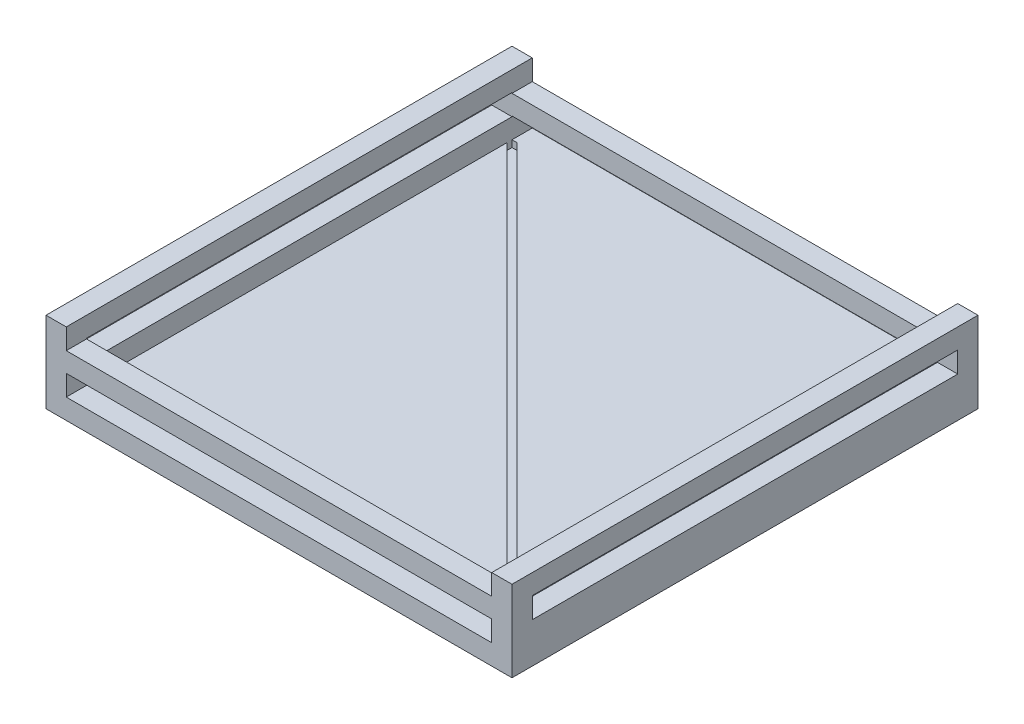
ISO-10303-21;
HEADER;
FILE_DESCRIPTION(('STEP AP214'),'2;1');
FILE_NAME('part.step','',(''),(''),'','','');
FILE_SCHEMA(('AUTOMOTIVE_DESIGN { 1 0 10303 214 1 1 1 1 }'));
ENDSEC;
DATA;
#1=APPLICATION_CONTEXT('core data for automotive mechanical design processes');
#2=APPLICATION_PROTOCOL_DEFINITION('international standard','automotive_design',2000,#1);
#3=PRODUCT_CONTEXT('',#1,'mechanical');
#4=PRODUCT('Part','Part','',(#3));
#5=PRODUCT_RELATED_PRODUCT_CATEGORY('part','',(#4));
#6=PRODUCT_DEFINITION_FORMATION('','',#4);
#7=PRODUCT_DEFINITION_CONTEXT('part definition',#1,'design');
#8=PRODUCT_DEFINITION('design','',#6,#7);
#9=PRODUCT_DEFINITION_SHAPE('','',#8);
#10=(LENGTH_UNIT() NAMED_UNIT(*) SI_UNIT(.MILLI.,.METRE.));
#11=(NAMED_UNIT(*) PLANE_ANGLE_UNIT() SI_UNIT($,.RADIAN.));
#12=(NAMED_UNIT(*) SI_UNIT($,.STERADIAN.) SOLID_ANGLE_UNIT());
#13=UNCERTAINTY_MEASURE_WITH_UNIT(LENGTH_MEASURE(1.E-05),#10,'distance_accuracy_value','');
#14=(GEOMETRIC_REPRESENTATION_CONTEXT(3) GLOBAL_UNCERTAINTY_ASSIGNED_CONTEXT((#13)) GLOBAL_UNIT_ASSIGNED_CONTEXT((#10,
#11,#12)) REPRESENTATION_CONTEXT('',''));
#15=CARTESIAN_POINT('',(0.,0.,0.));
#16=DIRECTION('',(0.,0.,1.));
#17=DIRECTION('',(1.,0.,0.));
#18=AXIS2_PLACEMENT_3D('',#15,#16,#17);
#19=CARTESIAN_POINT('',(0.,5.,0.));
#20=DIRECTION('',(0.,1.,0.));
#21=DIRECTION('',(0.,0.,1.));
#22=AXIS2_PLACEMENT_3D('',#19,#20,#21);
#23=PLANE('',#22);
#24=DIRECTION('',(1.,0.,0.));
#25=VECTOR('',#24,1.);
#26=CARTESIAN_POINT('',(52.5,5.,52.5));
#27=LINE('',#26,#25);
#28=CARTESIAN_POINT('',(51.2649201555275,5.,52.5));
#29=VERTEX_POINT('',#28);
#30=CARTESIAN_POINT('',(52.5,5.,52.5));
#31=VERTEX_POINT('',#30);
#32=EDGE_CURVE('E268',#29,#31,#27,.T.);
#33=ORIENTED_EDGE('',*,*,#32,.F.);
#34=DIRECTION('',(0.707106781186547,0.,0.707106781186547));
#35=VECTOR('',#34,1.);
#36=CARTESIAN_POINT('',(-52.5,5.,-51.2649201555275));
#37=LINE('',#36,#35);
#38=CARTESIAN_POINT('',(-52.5,5.,-51.2649201555275));
#39=VERTEX_POINT('',#38);
#40=EDGE_CURVE('E272',#39,#29,#37,.T.);
#41=ORIENTED_EDGE('',*,*,#40,.F.);
#42=DIRECTION('',(0.,0.,-1.));
#43=VECTOR('',#42,1.);
#44=CARTESIAN_POINT('',(-52.5,5.,0.));
#45=LINE('',#44,#43);
#46=CARTESIAN_POINT('',(-52.5,5.,57.5));
#47=VERTEX_POINT('',#46);
#48=EDGE_CURVE('E462',#47,#39,#45,.T.);
#49=ORIENTED_EDGE('',*,*,#48,.F.);
#50=DIRECTION('',(1.,0.,0.));
#51=VECTOR('',#50,1.);
#52=CARTESIAN_POINT('',(-57.5,5.,57.5));
#53=LINE('',#52,#51);
#54=CARTESIAN_POINT('',(52.5,5.,57.5));
#55=VERTEX_POINT('',#54);
#56=EDGE_CURVE('E517',#47,#55,#53,.T.);
#57=ORIENTED_EDGE('',*,*,#56,.T.);
#58=DIRECTION('',(0.,0.,-1.));
#59=VECTOR('',#58,1.);
#60=CARTESIAN_POINT('',(52.5,5.,-52.5));
#61=LINE('',#60,#59);
#62=EDGE_CURVE('E440',#55,#31,#61,.T.);
#63=ORIENTED_EDGE('',*,*,#62,.T.);
#64=EDGE_LOOP('',(#33,#41,#49,#57,#63));
#65=FACE_BOUND('',#64,.T.);
#66=ADVANCED_FACE('F46',(#65),#23,.T.);
#67=CARTESIAN_POINT('',(-52.5,0.,0.));
#68=DIRECTION('',(-1.,0.,0.));
#69=DIRECTION('',(0.,0.,1.));
#70=AXIS2_PLACEMENT_3D('',#67,#68,#69);
#71=PLANE('',#70);
#72=DIRECTION('',(0.,0.,1.));
#73=VECTOR('',#72,1.);
#74=CARTESIAN_POINT('',(-52.5,9.92,0.));
#75=LINE('',#74,#73);
#76=CARTESIAN_POINT('',(-52.5,9.92,-52.5));
#77=VERTEX_POINT('',#76);
#78=CARTESIAN_POINT('',(-52.5,9.92,52.5));
#79=VERTEX_POINT('',#78);
#80=EDGE_CURVE('E448',#77,#79,#75,.T.);
#81=ORIENTED_EDGE('',*,*,#80,.T.);
#82=DIRECTION('',(0.,1.,0.));
#83=VECTOR('',#82,1.);
#84=CARTESIAN_POINT('',(-52.5,0.,52.5));
#85=LINE('',#84,#83);
#86=CARTESIAN_POINT('',(-52.5,10.08,52.5));
#87=VERTEX_POINT('',#86);
#88=EDGE_CURVE('E444',#79,#87,#85,.T.);
#89=ORIENTED_EDGE('',*,*,#88,.T.);
#90=DIRECTION('',(0.,0.,-1.));
#91=VECTOR('',#90,1.);
#92=CARTESIAN_POINT('',(-52.5,10.08,173.474135047432));
#93=LINE('',#92,#91);
#94=CARTESIAN_POINT('',(-52.5,10.08,57.5));
#95=VERTEX_POINT('',#94);
#96=EDGE_CURVE('E328',#95,#87,#93,.T.);
#97=ORIENTED_EDGE('',*,*,#96,.F.);
#98=DIRECTION('',(0.,1.,0.));
#99=VECTOR('',#98,1.);
#100=CARTESIAN_POINT('',(-52.5,0.,57.5));
#101=LINE('',#100,#99);
#102=EDGE_CURVE('E467',#47,#95,#101,.T.);
#103=ORIENTED_EDGE('',*,*,#102,.F.);
#104=ORIENTED_EDGE('',*,*,#48,.T.);
#105=DIRECTION('',(0.,1.,0.));
#106=VECTOR('',#105,1.);
#107=CARTESIAN_POINT('',(-52.5,3.33,-51.2649201555275));
#108=LINE('',#107,#106);
#109=CARTESIAN_POINT('',(-52.5,3.33,-51.2649201555275));
#110=VERTEX_POINT('',#109);
#111=EDGE_CURVE('E303',#110,#39,#108,.T.);
#112=ORIENTED_EDGE('',*,*,#111,.F.);
#113=DIRECTION('',(0.,0.,1.));
#114=VECTOR('',#113,1.);
#115=CARTESIAN_POINT('',(-52.5,3.33,-51.2649201555275));
#116=LINE('',#115,#114);
#117=CARTESIAN_POINT('',(-52.5,3.33,-52.5));
#118=VERTEX_POINT('',#117);
#119=EDGE_CURVE('E277',#118,#110,#116,.T.);
#120=ORIENTED_EDGE('',*,*,#119,.F.);
#121=DIRECTION('',(0.,1.,0.));
#122=VECTOR('',#121,1.);
#123=CARTESIAN_POINT('',(-52.5,3.33,-52.5));
#124=LINE('',#123,#122);
#125=CARTESIAN_POINT('',(-52.5,5.,-52.5));
#126=VERTEX_POINT('',#125);
#127=EDGE_CURVE('E306',#118,#126,#124,.T.);
#128=ORIENTED_EDGE('',*,*,#127,.T.);
#129=CARTESIAN_POINT('',(-52.5,5.,-57.5));
#130=VERTEX_POINT('',#129);
#131=EDGE_CURVE('E461',#126,#130,#45,.T.);
#132=ORIENTED_EDGE('',*,*,#131,.T.);
#133=DIRECTION('',(0.,1.,0.));
#134=VECTOR('',#133,1.);
#135=CARTESIAN_POINT('',(-52.5,0.,-57.5));
#136=LINE('',#135,#134);
#137=CARTESIAN_POINT('',(-52.5,10.08,-57.5));
#138=VERTEX_POINT('',#137);
#139=EDGE_CURVE('E475',#130,#138,#136,.T.);
#140=ORIENTED_EDGE('',*,*,#139,.T.);
#141=DIRECTION('',(0.,0.,-1.));
#142=VECTOR('',#141,1.);
#143=CARTESIAN_POINT('',(-52.5,10.08,-52.5));
#144=LINE('',#143,#142);
#145=CARTESIAN_POINT('',(-52.5,10.08,-52.5));
#146=VERTEX_POINT('',#145);
#147=EDGE_CURVE('E433',#146,#138,#144,.T.);
#148=ORIENTED_EDGE('',*,*,#147,.F.);
#149=DIRECTION('',(0.,1.,0.));
#150=VECTOR('',#149,1.);
#151=CARTESIAN_POINT('',(-52.5,0.,-52.5));
#152=LINE('',#151,#150);
#153=EDGE_CURVE('E453',#77,#146,#152,.T.);
#154=ORIENTED_EDGE('',*,*,#153,.F.);
#155=EDGE_LOOP('',(#81,#89,#97,#103,#104,#112,#120,#128,#132,#140,#148,#154));
#156=FACE_BOUND('',#155,.T.);
#157=ADVANCED_FACE('F596',(#156),#71,.F.);
#158=DIRECTION('',(0.,0.,1.));
#159=VECTOR('',#158,1.);
#160=CARTESIAN_POINT('',(-52.5,20.,0.));
#161=LINE('',#160,#159);
#162=CARTESIAN_POINT('',(-52.5,20.,-57.5));
#163=VERTEX_POINT('',#162);
#164=CARTESIAN_POINT('',(-52.5,20.,57.5));
#165=VERTEX_POINT('',#164);
#166=EDGE_CURVE('E471',#163,#165,#161,.T.);
#167=ORIENTED_EDGE('',*,*,#166,.T.);
#168=CARTESIAN_POINT('',(-52.5,14.92,57.5));
#169=VERTEX_POINT('',#168);
#170=EDGE_CURVE('E466',#169,#165,#101,.T.);
#171=ORIENTED_EDGE('',*,*,#170,.F.);
#172=DIRECTION('',(0.,0.,-1.));
#173=VECTOR('',#172,1.);
#174=CARTESIAN_POINT('',(-52.5,14.92,173.474135047432));
#175=LINE('',#174,#173);
#176=CARTESIAN_POINT('',(-52.5,14.92,52.5));
#177=VERTEX_POINT('',#176);
#178=EDGE_CURVE('E70',#169,#177,#175,.T.);
#179=ORIENTED_EDGE('',*,*,#178,.T.);
#180=CARTESIAN_POINT('',(-52.5,15.08,52.5));
#181=VERTEX_POINT('',#180);
#182=EDGE_CURVE('E449',#177,#181,#85,.T.);
#183=ORIENTED_EDGE('',*,*,#182,.T.);
#184=DIRECTION('',(0.,0.,1.));
#185=VECTOR('',#184,1.);
#186=CARTESIAN_POINT('',(-52.5,15.08,0.));
#187=LINE('',#186,#185);
#188=CARTESIAN_POINT('',(-52.5,15.08,-52.5));
#189=VERTEX_POINT('',#188);
#190=EDGE_CURVE('E457',#189,#181,#187,.T.);
#191=ORIENTED_EDGE('',*,*,#190,.F.);
#192=CARTESIAN_POINT('',(-52.5,14.92,-52.5));
#193=VERTEX_POINT('',#192);
#194=EDGE_CURVE('E452',#193,#189,#152,.T.);
#195=ORIENTED_EDGE('',*,*,#194,.F.);
#196=DIRECTION('',(0.,0.,-1.));
#197=VECTOR('',#196,1.);
#198=CARTESIAN_POINT('',(-52.5,14.92,-52.5));
#199=LINE('',#198,#197);
#200=CARTESIAN_POINT('',(-52.5,14.92,-57.5));
#201=VERTEX_POINT('',#200);
#202=EDGE_CURVE('E429',#193,#201,#199,.T.);
#203=ORIENTED_EDGE('',*,*,#202,.T.);
#204=EDGE_CURVE('E474',#201,#163,#136,.T.);
#205=ORIENTED_EDGE('',*,*,#204,.T.);
#206=EDGE_LOOP('',(#167,#171,#179,#183,#191,#195,#203,#205));
#207=FACE_BOUND('',#206,.T.);
#208=ADVANCED_FACE('F603',(#207),#71,.F.);
#209=CARTESIAN_POINT('',(52.5,14.92,-52.5));
#210=DIRECTION('',(-1.,0.,0.));
#211=DIRECTION('',(0.,0.,1.));
#212=AXIS2_PLACEMENT_3D('',#209,#210,#211);
#213=PLANE('',#212);
#214=DIRECTION('',(0.,-1.,0.));
#215=VECTOR('',#214,1.);
#216=CARTESIAN_POINT('',(52.5,10.08,-57.5));
#217=LINE('',#216,#215);
#218=CARTESIAN_POINT('',(52.5,10.08,-57.5));
#219=VERTEX_POINT('',#218);
#220=CARTESIAN_POINT('',(52.5,5.,-57.5));
#221=VERTEX_POINT('',#220);
#222=EDGE_CURVE('E340',#219,#221,#217,.T.);
#223=ORIENTED_EDGE('',*,*,#222,.T.);
#224=CARTESIAN_POINT('',(52.5,5.,51.2649201555275));
#225=VERTEX_POINT('',#224);
#226=EDGE_CURVE('E250',#225,#221,#61,.T.);
#227=ORIENTED_EDGE('',*,*,#226,.F.);
#228=DIRECTION('',(0.,1.,0.));
#229=VECTOR('',#228,1.);
#230=CARTESIAN_POINT('',(52.5,3.33,51.2649201555275));
#231=LINE('',#230,#229);
#232=CARTESIAN_POINT('',(52.5,3.33,51.2649201555275));
#233=VERTEX_POINT('',#232);
#234=EDGE_CURVE('E62',#233,#225,#231,.T.);
#235=ORIENTED_EDGE('',*,*,#234,.F.);
#236=DIRECTION('',(0.,0.,-1.));
#237=VECTOR('',#236,1.);
#238=CARTESIAN_POINT('',(52.5,3.33,51.2649201555275));
#239=LINE('',#238,#237);
#240=CARTESIAN_POINT('',(52.5,3.33,52.5));
#241=VERTEX_POINT('',#240);
#242=EDGE_CURVE('E248',#241,#233,#239,.T.);
#243=ORIENTED_EDGE('',*,*,#242,.F.);
#244=DIRECTION('',(0.,1.,0.));
#245=VECTOR('',#244,1.);
#246=CARTESIAN_POINT('',(52.5,3.33,52.5));
#247=LINE('',#246,#245);
#248=EDGE_CURVE('E296',#241,#31,#247,.T.);
#249=ORIENTED_EDGE('',*,*,#248,.T.);
#250=ORIENTED_EDGE('',*,*,#62,.F.);
#251=DIRECTION('',(0.,1.,0.));
#252=VECTOR('',#251,1.);
#253=CARTESIAN_POINT('',(52.5,14.92,57.5));
#254=LINE('',#253,#252);
#255=CARTESIAN_POINT('',(52.5,10.08,57.5));
#256=VERTEX_POINT('',#255);
#257=EDGE_CURVE('E377',#55,#256,#254,.T.);
#258=ORIENTED_EDGE('',*,*,#257,.T.);
#259=DIRECTION('',(0.,0.,-1.));
#260=VECTOR('',#259,1.);
#261=CARTESIAN_POINT('',(52.5,10.08,173.474135047432));
#262=LINE('',#261,#260);
#263=CARTESIAN_POINT('',(52.5,10.08,52.5));
#264=VERTEX_POINT('',#263);
#265=EDGE_CURVE('E325',#256,#264,#262,.T.);
#266=ORIENTED_EDGE('',*,*,#265,.T.);
#267=DIRECTION('',(0.,1.,0.));
#268=VECTOR('',#267,1.);
#269=CARTESIAN_POINT('',(52.5,14.92,52.5));
#270=LINE('',#269,#268);
#271=CARTESIAN_POINT('',(52.5,9.92,52.5));
#272=VERTEX_POINT('',#271);
#273=EDGE_CURVE('E358',#272,#264,#270,.T.);
#274=ORIENTED_EDGE('',*,*,#273,.F.);
#275=DIRECTION('',(0.,0.,1.));
#276=VECTOR('',#275,1.);
#277=CARTESIAN_POINT('',(52.5,9.92,-52.5));
#278=LINE('',#277,#276);
#279=CARTESIAN_POINT('',(52.5,9.92,-52.5));
#280=VERTEX_POINT('',#279);
#281=EDGE_CURVE('E353',#280,#272,#278,.T.);
#282=ORIENTED_EDGE('',*,*,#281,.F.);
#283=DIRECTION('',(0.,-1.,0.));
#284=VECTOR('',#283,1.);
#285=CARTESIAN_POINT('',(52.5,10.08,-52.5));
#286=LINE('',#285,#284);
#287=CARTESIAN_POINT('',(52.5,10.08,-52.5));
#288=VERTEX_POINT('',#287);
#289=EDGE_CURVE('E383',#288,#280,#286,.T.);
#290=ORIENTED_EDGE('',*,*,#289,.F.);
#291=DIRECTION('',(0.,0.,-1.));
#292=VECTOR('',#291,1.);
#293=CARTESIAN_POINT('',(52.5,10.08,-52.5));
#294=LINE('',#293,#292);
#295=EDGE_CURVE('E437',#288,#219,#294,.T.);
#296=ORIENTED_EDGE('',*,*,#295,.T.);
#297=EDGE_LOOP('',(#223,#227,#235,#243,#249,#250,#258,#266,#274,#282,#290,#296));
#298=FACE_BOUND('',#297,.T.);
#299=ADVANCED_FACE('F246',(#298),#213,.T.);
#300=DIRECTION('',(0.,0.,-1.));
#301=VECTOR('',#300,1.);
#302=CARTESIAN_POINT('',(52.5,15.08,-52.5));
#303=LINE('',#302,#301);
#304=CARTESIAN_POINT('',(52.5,15.08,52.5));
#305=VERTEX_POINT('',#304);
#306=CARTESIAN_POINT('',(52.5,15.08,-52.5));
#307=VERTEX_POINT('',#306);
#308=EDGE_CURVE('E318',#305,#307,#303,.T.);
#309=ORIENTED_EDGE('',*,*,#308,.F.);
#310=CARTESIAN_POINT('',(52.5,14.92,52.5));
#311=VERTEX_POINT('',#310);
#312=EDGE_CURVE('E357',#311,#305,#270,.T.);
#313=ORIENTED_EDGE('',*,*,#312,.F.);
#314=DIRECTION('',(0.,0.,-1.));
#315=VECTOR('',#314,1.);
#316=CARTESIAN_POINT('',(52.5,14.92,173.474135047432));
#317=LINE('',#316,#315);
#318=CARTESIAN_POINT('',(52.5,14.92,57.5));
#319=VERTEX_POINT('',#318);
#320=EDGE_CURVE('E315',#319,#311,#317,.T.);
#321=ORIENTED_EDGE('',*,*,#320,.F.);
#322=CARTESIAN_POINT('',(52.5,20.,57.5));
#323=VERTEX_POINT('',#322);
#324=EDGE_CURVE('E367',#319,#323,#254,.T.);
#325=ORIENTED_EDGE('',*,*,#324,.T.);
#326=DIRECTION('',(0.,0.,-1.));
#327=VECTOR('',#326,1.);
#328=CARTESIAN_POINT('',(52.5,20.,-52.5));
#329=LINE('',#328,#327);
#330=CARTESIAN_POINT('',(52.5,20.,-57.5));
#331=VERTEX_POINT('',#330);
#332=EDGE_CURVE('E423',#323,#331,#329,.T.);
#333=ORIENTED_EDGE('',*,*,#332,.T.);
#334=DIRECTION('',(0.,1.,0.));
#335=VECTOR('',#334,1.);
#336=CARTESIAN_POINT('',(52.5,14.92,-57.5));
#337=LINE('',#336,#335);
#338=CARTESIAN_POINT('',(52.5,14.92,-57.5));
#339=VERTEX_POINT('',#338);
#340=EDGE_CURVE('E412',#339,#331,#337,.T.);
#341=ORIENTED_EDGE('',*,*,#340,.F.);
#342=DIRECTION('',(0.,0.,-1.));
#343=VECTOR('',#342,1.);
#344=CARTESIAN_POINT('',(52.5,14.92,-52.5));
#345=LINE('',#344,#343);
#346=CARTESIAN_POINT('',(52.5,14.92,-52.5));
#347=VERTEX_POINT('',#346);
#348=EDGE_CURVE('E426',#347,#339,#345,.T.);
#349=ORIENTED_EDGE('',*,*,#348,.F.);
#350=DIRECTION('',(0.,1.,0.));
#351=VECTOR('',#350,1.);
#352=CARTESIAN_POINT('',(52.5,14.92,-52.5));
#353=LINE('',#352,#351);
#354=EDGE_CURVE('E395',#347,#307,#353,.T.);
#355=ORIENTED_EDGE('',*,*,#354,.T.);
#356=EDGE_LOOP('',(#309,#313,#321,#325,#333,#341,#349,#355));
#357=FACE_BOUND('',#356,.T.);
#358=ADVANCED_FACE('F577',(#357),#213,.T.);
#359=CARTESIAN_POINT('',(-52.5,0.,-52.5));
#360=DIRECTION('',(0.,0.,1.));
#361=DIRECTION('',(1.,0.,0.));
#362=AXIS2_PLACEMENT_3D('',#359,#360,#361);
#363=PLANE('',#362);
#364=DIRECTION('',(-1.,0.,0.));
#365=VECTOR('',#364,1.);
#366=CARTESIAN_POINT('',(52.5,10.08,-52.5));
#367=LINE('',#366,#365);
#368=EDGE_CURVE('E386',#288,#146,#367,.T.);
#369=ORIENTED_EDGE('',*,*,#368,.F.);
#370=ORIENTED_EDGE('',*,*,#289,.T.);
#371=DIRECTION('',(-1.,0.,0.));
#372=VECTOR('',#371,1.);
#373=CARTESIAN_POINT('',(173.474135047432,9.92,-52.5));
#374=LINE('',#373,#372);
#375=CARTESIAN_POINT('',(57.5,9.92,-52.5));
#376=VERTEX_POINT('',#375);
#377=EDGE_CURVE('E371',#376,#280,#374,.T.);
#378=ORIENTED_EDGE('',*,*,#377,.F.);
#379=DIRECTION('',(0.,1.,0.));
#380=VECTOR('',#379,1.);
#381=CARTESIAN_POINT('',(57.5,5.,-52.5));
#382=LINE('',#381,#380);
#383=CARTESIAN_POINT('',(57.5,15.08,-52.5));
#384=VERTEX_POINT('',#383);
#385=EDGE_CURVE('E399',#376,#384,#382,.T.);
#386=ORIENTED_EDGE('',*,*,#385,.T.);
#387=DIRECTION('',(-1.,0.,0.));
#388=VECTOR('',#387,1.);
#389=CARTESIAN_POINT('',(173.474135047432,15.08,-52.5));
#390=LINE('',#389,#388);
#391=EDGE_CURVE('E362',#384,#307,#390,.T.);
#392=ORIENTED_EDGE('',*,*,#391,.T.);
#393=ORIENTED_EDGE('',*,*,#354,.F.);
#394=DIRECTION('',(-1.,0.,0.));
#395=VECTOR('',#394,1.);
#396=CARTESIAN_POINT('',(52.5,14.92,-52.5));
#397=LINE('',#396,#395);
#398=EDGE_CURVE('E391',#347,#193,#397,.T.);
#399=ORIENTED_EDGE('',*,*,#398,.T.);
#400=ORIENTED_EDGE('',*,*,#194,.T.);
#401=DIRECTION('',(-1.,0.,0.));
#402=VECTOR('',#401,1.);
#403=CARTESIAN_POINT('',(-52.5,15.08,-52.5));
#404=LINE('',#403,#402);
#405=CARTESIAN_POINT('',(-57.5,15.08,-52.5));
#406=VERTEX_POINT('',#405);
#407=EDGE_CURVE('E508',#189,#406,#404,.T.);
#408=ORIENTED_EDGE('',*,*,#407,.T.);
#409=DIRECTION('',(0.,1.,0.));
#410=VECTOR('',#409,1.);
#411=CARTESIAN_POINT('',(-57.5,0.,-52.5));
#412=LINE('',#411,#410);
#413=CARTESIAN_POINT('',(-57.5,9.92,-52.5));
#414=VERTEX_POINT('',#413);
#415=EDGE_CURVE('E485',#414,#406,#412,.T.);
#416=ORIENTED_EDGE('',*,*,#415,.F.);
#417=DIRECTION('',(-1.,0.,0.));
#418=VECTOR('',#417,1.);
#419=CARTESIAN_POINT('',(-52.5,9.92,-52.5));
#420=LINE('',#419,#418);
#421=EDGE_CURVE('E511',#77,#414,#420,.T.);
#422=ORIENTED_EDGE('',*,*,#421,.F.);
#423=ORIENTED_EDGE('',*,*,#153,.T.);
#424=EDGE_LOOP('',(#369,#370,#378,#386,#392,#393,#399,#400,#408,#416,#422,#423));
#425=FACE_BOUND('',#424,.T.);
#426=ADVANCED_FACE('F610',(#425),#363,.T.);
#427=DIRECTION('',(-1.,0.,0.));
#428=VECTOR('',#427,1.);
#429=CARTESIAN_POINT('',(-52.5,5.,-52.5));
#430=LINE('',#429,#428);
#431=CARTESIAN_POINT('',(-51.2649201555275,5.,-52.5));
#432=VERTEX_POINT('',#431);
#433=EDGE_CURVE('E289',#432,#126,#430,.T.);
#434=ORIENTED_EDGE('',*,*,#433,.F.);
#435=DIRECTION('',(-0.707106781186547,0.,-0.707106781186548));
#436=VECTOR('',#435,1.);
#437=CARTESIAN_POINT('',(52.5,5.,51.2649201555275));
#438=LINE('',#437,#436);
#439=EDGE_CURVE('E286',#225,#432,#438,.T.);
#440=ORIENTED_EDGE('',*,*,#439,.F.);
#441=ORIENTED_EDGE('',*,*,#226,.T.);
#442=DIRECTION('',(-1.,0.,0.));
#443=VECTOR('',#442,1.);
#444=CARTESIAN_POINT('',(-57.5,5.,-57.5));
#445=LINE('',#444,#443);
#446=EDGE_CURVE('E521',#221,#130,#445,.T.);
#447=ORIENTED_EDGE('',*,*,#446,.T.);
#448=ORIENTED_EDGE('',*,*,#131,.F.);
#449=EDGE_LOOP('',(#434,#440,#441,#447,#448));
#450=FACE_BOUND('',#449,.T.);
#451=ADVANCED_FACE('F599',(#450),#23,.T.);
#452=CARTESIAN_POINT('',(-57.5,5.,-57.5));
#453=DIRECTION('',(1.,0.,0.));
#454=DIRECTION('',(0.,0.,-1.));
#455=AXIS2_PLACEMENT_3D('',#452,#453,#454);
#456=PLANE('',#455);
#457=DIRECTION('',(0.,1.,0.));
#458=VECTOR('',#457,1.);
#459=CARTESIAN_POINT('',(-57.5,0.,52.5));
#460=LINE('',#459,#458);
#461=CARTESIAN_POINT('',(-57.5,9.92,52.5));
#462=VERTEX_POINT('',#461);
#463=CARTESIAN_POINT('',(-57.5,15.08,52.5));
#464=VERTEX_POINT('',#463);
#465=EDGE_CURVE('E422',#462,#464,#460,.T.);
#466=ORIENTED_EDGE('',*,*,#465,.F.);
#467=DIRECTION('',(0.,0.,1.));
#468=VECTOR('',#467,1.);
#469=CARTESIAN_POINT('',(-57.5,9.92,0.));
#470=LINE('',#469,#468);
#471=EDGE_CURVE('E482',#414,#462,#470,.T.);
#472=ORIENTED_EDGE('',*,*,#471,.F.);
#473=ORIENTED_EDGE('',*,*,#415,.T.);
#474=DIRECTION('',(0.,0.,1.));
#475=VECTOR('',#474,1.);
#476=CARTESIAN_POINT('',(-57.5,15.08,0.));
#477=LINE('',#476,#475);
#478=EDGE_CURVE('E489',#406,#464,#477,.T.);
#479=ORIENTED_EDGE('',*,*,#478,.T.);
#480=EDGE_LOOP('',(#466,#472,#473,#479));
#481=FACE_BOUND('',#480,.T.);
#482=DIRECTION('',(0.,-1.,0.));
#483=VECTOR('',#482,1.);
#484=CARTESIAN_POINT('',(-57.5,5.,57.5));
#485=LINE('',#484,#483);
#486=CARTESIAN_POINT('',(-57.5,20.,57.5));
#487=VERTEX_POINT('',#486);
#488=CARTESIAN_POINT('',(-57.5,0.,57.5));
#489=VERTEX_POINT('',#488);
#490=EDGE_CURVE('E11',#487,#489,#485,.T.);
#491=ORIENTED_EDGE('',*,*,#490,.F.);
#492=DIRECTION('',(0.,0.,1.));
#493=VECTOR('',#492,1.);
#494=CARTESIAN_POINT('',(-57.5,20.,0.));
#495=LINE('',#494,#493);
#496=CARTESIAN_POINT('',(-57.5,20.,-57.5));
#497=VERTEX_POINT('',#496);
#498=EDGE_CURVE('E493',#497,#487,#495,.T.);
#499=ORIENTED_EDGE('',*,*,#498,.F.);
#500=DIRECTION('',(0.,-1.,0.));
#501=VECTOR('',#500,1.);
#502=CARTESIAN_POINT('',(-57.5,5.,-57.5));
#503=LINE('',#502,#501);
#504=CARTESIAN_POINT('',(-57.5,0.,-57.5));
#505=VERTEX_POINT('',#504);
#506=EDGE_CURVE('E526',#497,#505,#503,.T.);
#507=ORIENTED_EDGE('',*,*,#506,.T.);
#508=DIRECTION('',(0.,0.,1.));
#509=VECTOR('',#508,1.);
#510=CARTESIAN_POINT('',(-57.5,0.,-57.5));
#511=LINE('',#510,#509);
#512=EDGE_CURVE('E500',#505,#489,#511,.T.);
#513=ORIENTED_EDGE('',*,*,#512,.T.);
#514=EDGE_LOOP('',(#491,#499,#507,#513));
#515=FACE_BOUND('',#514,.T.);
#516=ADVANCED_FACE('F48',(#481,#515),#456,.F.);
#517=CARTESIAN_POINT('',(-57.5,5.,57.5));
#518=DIRECTION('',(0.,0.,-1.));
#519=DIRECTION('',(-1.,0.,0.));
#520=AXIS2_PLACEMENT_3D('',#517,#518,#519);
#521=PLANE('',#520);
#522=DIRECTION('',(1.,0.,0.));
#523=VECTOR('',#522,1.);
#524=CARTESIAN_POINT('',(-57.5,0.,57.5));
#525=LINE('',#524,#523);
#526=CARTESIAN_POINT('',(57.5,0.,57.5));
#527=VERTEX_POINT('',#526);
#528=EDGE_CURVE('E530',#489,#527,#525,.T.);
#529=ORIENTED_EDGE('',*,*,#528,.T.);
#530=DIRECTION('',(0.,-1.,0.));
#531=VECTOR('',#530,1.);
#532=CARTESIAN_POINT('',(57.5,5.,57.5));
#533=LINE('',#532,#531);
#534=CARTESIAN_POINT('',(57.5,20.,57.5));
#535=VERTEX_POINT('',#534);
#536=EDGE_CURVE('E55',#535,#527,#533,.T.);
#537=ORIENTED_EDGE('',*,*,#536,.F.);
#538=DIRECTION('',(-1.,0.,0.));
#539=VECTOR('',#538,1.);
#540=CARTESIAN_POINT('',(173.474135047432,20.,57.5));
#541=LINE('',#540,#539);
#542=EDGE_CURVE('E349',#535,#323,#541,.T.);
#543=ORIENTED_EDGE('',*,*,#542,.T.);
#544=ORIENTED_EDGE('',*,*,#324,.F.);
#545=DIRECTION('',(1.,0.,0.));
#546=VECTOR('',#545,1.);
#547=CARTESIAN_POINT('',(-52.5,14.92,57.5));
#548=LINE('',#547,#546);
#549=EDGE_CURVE('E314',#169,#319,#548,.T.);
#550=ORIENTED_EDGE('',*,*,#549,.F.);
#551=ORIENTED_EDGE('',*,*,#170,.T.);
#552=DIRECTION('',(-1.,0.,0.));
#553=VECTOR('',#552,1.);
#554=CARTESIAN_POINT('',(-52.5,20.,57.5));
#555=LINE('',#554,#553);
#556=EDGE_CURVE('E501',#165,#487,#555,.T.);
#557=ORIENTED_EDGE('',*,*,#556,.T.);
#558=ORIENTED_EDGE('',*,*,#490,.T.);
#559=EDGE_LOOP('',(#529,#537,#543,#544,#550,#551,#557,#558));
#560=FACE_BOUND('',#559,.T.);
#561=ORIENTED_EDGE('',*,*,#257,.F.);
#562=ORIENTED_EDGE('',*,*,#56,.F.);
#563=ORIENTED_EDGE('',*,*,#102,.T.);
#564=DIRECTION('',(-1.,0.,0.));
#565=VECTOR('',#564,1.);
#566=CARTESIAN_POINT('',(-52.5,10.08,57.5));
#567=LINE('',#566,#565);
#568=EDGE_CURVE('E311',#256,#95,#567,.T.);
#569=ORIENTED_EDGE('',*,*,#568,.F.);
#570=EDGE_LOOP('',(#561,#562,#563,#569));
#571=FACE_BOUND('',#570,.T.);
#572=ADVANCED_FACE('F555',(#560,#571),#521,.F.);
#573=CARTESIAN_POINT('',(57.5,5.,-57.5));
#574=DIRECTION('',(-1.,0.,0.));
#575=DIRECTION('',(0.,0.,1.));
#576=AXIS2_PLACEMENT_3D('',#573,#574,#575);
#577=PLANE('',#576);
#578=DIRECTION('',(0.,-1.,0.));
#579=VECTOR('',#578,1.);
#580=CARTESIAN_POINT('',(57.5,14.92,52.5));
#581=LINE('',#580,#579);
#582=CARTESIAN_POINT('',(57.5,15.08,52.5));
#583=VERTEX_POINT('',#582);
#584=CARTESIAN_POINT('',(57.5,9.92,52.5));
#585=VERTEX_POINT('',#584);
#586=EDGE_CURVE('E341',#583,#585,#581,.T.);
#587=ORIENTED_EDGE('',*,*,#586,.F.);
#588=DIRECTION('',(0.,0.,1.));
#589=VECTOR('',#588,1.);
#590=CARTESIAN_POINT('',(57.5,15.08,-52.5));
#591=LINE('',#590,#589);
#592=EDGE_CURVE('E345',#384,#583,#591,.T.);
#593=ORIENTED_EDGE('',*,*,#592,.F.);
#594=ORIENTED_EDGE('',*,*,#385,.F.);
#595=DIRECTION('',(0.,0.,-1.));
#596=VECTOR('',#595,1.);
#597=CARTESIAN_POINT('',(57.5,9.92,-52.5));
#598=LINE('',#597,#596);
#599=EDGE_CURVE('E336',#585,#376,#598,.T.);
#600=ORIENTED_EDGE('',*,*,#599,.F.);
#601=EDGE_LOOP('',(#587,#593,#594,#600));
#602=FACE_BOUND('',#601,.T.);
#603=DIRECTION('',(0.,-1.,0.));
#604=VECTOR('',#603,1.);
#605=CARTESIAN_POINT('',(57.5,5.,-57.5));
#606=LINE('',#605,#604);
#607=CARTESIAN_POINT('',(57.5,20.,-57.5));
#608=VERTEX_POINT('',#607);
#609=CARTESIAN_POINT('',(57.5,0.,-57.5));
#610=VERTEX_POINT('',#609);
#611=EDGE_CURVE('E543',#608,#610,#606,.T.);
#612=ORIENTED_EDGE('',*,*,#611,.F.);
#613=DIRECTION('',(0.,0.,-1.));
#614=VECTOR('',#613,1.);
#615=CARTESIAN_POINT('',(57.5,20.,-52.5));
#616=LINE('',#615,#614);
#617=EDGE_CURVE('E419',#535,#608,#616,.T.);
#618=ORIENTED_EDGE('',*,*,#617,.F.);
#619=ORIENTED_EDGE('',*,*,#536,.T.);
#620=DIRECTION('',(0.,0.,-1.));
#621=VECTOR('',#620,1.);
#622=CARTESIAN_POINT('',(57.5,0.,-57.5));
#623=LINE('',#622,#621);
#624=EDGE_CURVE('E534',#527,#610,#623,.T.);
#625=ORIENTED_EDGE('',*,*,#624,.T.);
#626=EDGE_LOOP('',(#612,#618,#619,#625));
#627=FACE_BOUND('',#626,.T.);
#628=ADVANCED_FACE('F549',(#602,#627),#577,.F.);
#629=CARTESIAN_POINT('',(-57.5,5.,-57.5));
#630=DIRECTION('',(0.,0.,1.));
#631=DIRECTION('',(1.,0.,0.));
#632=AXIS2_PLACEMENT_3D('',#629,#630,#631);
#633=PLANE('',#632);
#634=ORIENTED_EDGE('',*,*,#611,.T.);
#635=DIRECTION('',(-1.,0.,0.));
#636=VECTOR('',#635,1.);
#637=CARTESIAN_POINT('',(-57.5,0.,-57.5));
#638=LINE('',#637,#636);
#639=EDGE_CURVE('E522',#610,#505,#638,.T.);
#640=ORIENTED_EDGE('',*,*,#639,.T.);
#641=ORIENTED_EDGE('',*,*,#506,.F.);
#642=DIRECTION('',(-1.,0.,0.));
#643=VECTOR('',#642,1.);
#644=CARTESIAN_POINT('',(-52.5,20.,-57.5));
#645=LINE('',#644,#643);
#646=EDGE_CURVE('E496',#163,#497,#645,.T.);
#647=ORIENTED_EDGE('',*,*,#646,.F.);
#648=ORIENTED_EDGE('',*,*,#204,.F.);
#649=DIRECTION('',(-1.,0.,0.));
#650=VECTOR('',#649,1.);
#651=CARTESIAN_POINT('',(52.5,14.92,-57.5));
#652=LINE('',#651,#650);
#653=EDGE_CURVE('E408',#339,#201,#652,.T.);
#654=ORIENTED_EDGE('',*,*,#653,.F.);
#655=ORIENTED_EDGE('',*,*,#340,.T.);
#656=DIRECTION('',(-1.,0.,0.));
#657=VECTOR('',#656,1.);
#658=CARTESIAN_POINT('',(57.5,20.,-57.5));
#659=LINE('',#658,#657);
#660=EDGE_CURVE('E387',#608,#331,#659,.T.);
#661=ORIENTED_EDGE('',*,*,#660,.F.);
#662=EDGE_LOOP('',(#634,#640,#641,#647,#648,#654,#655,#661));
#663=FACE_BOUND('',#662,.T.);
#664=ORIENTED_EDGE('',*,*,#446,.F.);
#665=ORIENTED_EDGE('',*,*,#222,.F.);
#666=DIRECTION('',(-1.,0.,0.));
#667=VECTOR('',#666,1.);
#668=CARTESIAN_POINT('',(52.5,10.08,-57.5));
#669=LINE('',#668,#667);
#670=EDGE_CURVE('E404',#219,#138,#669,.T.);
#671=ORIENTED_EDGE('',*,*,#670,.T.);
#672=ORIENTED_EDGE('',*,*,#139,.F.);
#673=EDGE_LOOP('',(#664,#665,#671,#672));
#674=FACE_BOUND('',#673,.T.);
#675=ADVANCED_FACE('F562',(#663,#674),#633,.F.);
#676=CARTESIAN_POINT('',(0.,0.,0.));
#677=DIRECTION('',(0.,1.,0.));
#678=DIRECTION('',(0.,0.,1.));
#679=AXIS2_PLACEMENT_3D('',#676,#677,#678);
#680=PLANE('',#679);
#681=ORIENTED_EDGE('',*,*,#512,.F.);
#682=ORIENTED_EDGE('',*,*,#639,.F.);
#683=ORIENTED_EDGE('',*,*,#624,.F.);
#684=ORIENTED_EDGE('',*,*,#528,.F.);
#685=EDGE_LOOP('',(#681,#682,#683,#684));
#686=FACE_BOUND('',#685,.T.);
#687=ADVANCED_FACE('F560',(#686),#680,.F.);
#688=CARTESIAN_POINT('',(-52.5,20.,0.));
#689=DIRECTION('',(0.,-1.,0.));
#690=DIRECTION('',(0.,0.,-1.));
#691=AXIS2_PLACEMENT_3D('',#688,#689,#690);
#692=PLANE('',#691);
#693=ORIENTED_EDGE('',*,*,#498,.T.);
#694=ORIENTED_EDGE('',*,*,#556,.F.);
#695=ORIENTED_EDGE('',*,*,#166,.F.);
#696=ORIENTED_EDGE('',*,*,#646,.T.);
#697=EDGE_LOOP('',(#693,#694,#695,#696));
#698=FACE_BOUND('',#697,.T.);
#699=ADVANCED_FACE('F673',(#698),#692,.F.);
#700=CARTESIAN_POINT('',(-52.5,0.,52.5));
#701=DIRECTION('',(0.,0.,1.));
#702=DIRECTION('',(1.,0.,0.));
#703=AXIS2_PLACEMENT_3D('',#700,#701,#702);
#704=PLANE('',#703);
#705=ORIENTED_EDGE('',*,*,#465,.T.);
#706=DIRECTION('',(-1.,0.,0.));
#707=VECTOR('',#706,1.);
#708=CARTESIAN_POINT('',(-52.5,15.08,52.5));
#709=LINE('',#708,#707);
#710=EDGE_CURVE('E505',#181,#464,#709,.T.);
#711=ORIENTED_EDGE('',*,*,#710,.F.);
#712=ORIENTED_EDGE('',*,*,#182,.F.);
#713=DIRECTION('',(-1.,0.,0.));
#714=VECTOR('',#713,1.);
#715=CARTESIAN_POINT('',(-52.5,14.92,52.5));
#716=LINE('',#715,#714);
#717=EDGE_CURVE('E299',#311,#177,#716,.T.);
#718=ORIENTED_EDGE('',*,*,#717,.F.);
#719=ORIENTED_EDGE('',*,*,#312,.T.);
#720=DIRECTION('',(-1.,0.,0.));
#721=VECTOR('',#720,1.);
#722=CARTESIAN_POINT('',(173.474135047432,15.08,52.5));
#723=LINE('',#722,#721);
#724=EDGE_CURVE('E363',#583,#305,#723,.T.);
#725=ORIENTED_EDGE('',*,*,#724,.F.);
#726=ORIENTED_EDGE('',*,*,#586,.T.);
#727=DIRECTION('',(-1.,0.,0.));
#728=VECTOR('',#727,1.);
#729=CARTESIAN_POINT('',(173.474135047432,9.92,52.5));
#730=LINE('',#729,#728);
#731=EDGE_CURVE('E368',#585,#272,#730,.T.);
#732=ORIENTED_EDGE('',*,*,#731,.T.);
#733=ORIENTED_EDGE('',*,*,#273,.T.);
#734=DIRECTION('',(1.,0.,0.));
#735=VECTOR('',#734,1.);
#736=CARTESIAN_POINT('',(-52.5,10.08,52.5));
#737=LINE('',#736,#735);
#738=EDGE_CURVE('E321',#87,#264,#737,.T.);
#739=ORIENTED_EDGE('',*,*,#738,.F.);
#740=ORIENTED_EDGE('',*,*,#88,.F.);
#741=DIRECTION('',(-1.,0.,0.));
#742=VECTOR('',#741,1.);
#743=CARTESIAN_POINT('',(-52.5,9.92,52.5));
#744=LINE('',#743,#742);
#745=EDGE_CURVE('E478',#79,#462,#744,.T.);
#746=ORIENTED_EDGE('',*,*,#745,.T.);
#747=EDGE_LOOP('',(#705,#711,#712,#718,#719,#725,#726,#732,#733,#739,#740,#746));
#748=FACE_BOUND('',#747,.T.);
#749=ADVANCED_FACE('F638',(#748),#704,.F.);
#750=CARTESIAN_POINT('',(-52.5,15.08,0.));
#751=DIRECTION('',(0.,-1.,0.));
#752=DIRECTION('',(0.,0.,-1.));
#753=AXIS2_PLACEMENT_3D('',#750,#751,#752);
#754=PLANE('',#753);
#755=ORIENTED_EDGE('',*,*,#478,.F.);
#756=ORIENTED_EDGE('',*,*,#407,.F.);
#757=ORIENTED_EDGE('',*,*,#190,.T.);
#758=ORIENTED_EDGE('',*,*,#710,.T.);
#759=EDGE_LOOP('',(#755,#756,#757,#758));
#760=FACE_BOUND('',#759,.T.);
#761=ADVANCED_FACE('F682',(#760),#754,.T.);
#762=CARTESIAN_POINT('',(-52.5,9.92,0.));
#763=DIRECTION('',(0.,-1.,0.));
#764=DIRECTION('',(0.,0.,-1.));
#765=AXIS2_PLACEMENT_3D('',#762,#763,#764);
#766=PLANE('',#765);
#767=ORIENTED_EDGE('',*,*,#471,.T.);
#768=ORIENTED_EDGE('',*,*,#745,.F.);
#769=ORIENTED_EDGE('',*,*,#80,.F.);
#770=ORIENTED_EDGE('',*,*,#421,.T.);
#771=EDGE_LOOP('',(#767,#768,#769,#770));
#772=FACE_BOUND('',#771,.T.);
#773=ADVANCED_FACE('F685',(#772),#766,.F.);
#774=CARTESIAN_POINT('',(57.5,20.,-52.5));
#775=DIRECTION('',(0.,-1.,0.));
#776=DIRECTION('',(1.,0.,0.));
#777=AXIS2_PLACEMENT_3D('',#774,#775,#776);
#778=PLANE('',#777);
#779=ORIENTED_EDGE('',*,*,#660,.T.);
#780=ORIENTED_EDGE('',*,*,#332,.F.);
#781=ORIENTED_EDGE('',*,*,#542,.F.);
#782=ORIENTED_EDGE('',*,*,#617,.T.);
#783=EDGE_LOOP('',(#779,#780,#781,#782));
#784=FACE_BOUND('',#783,.T.);
#785=ADVANCED_FACE('F570',(#784),#778,.F.);
#786=CARTESIAN_POINT('',(52.5,14.92,-52.5));
#787=DIRECTION('',(0.,-1.,0.));
#788=DIRECTION('',(0.,0.,-1.));
#789=AXIS2_PLACEMENT_3D('',#786,#787,#788);
#790=PLANE('',#789);
#791=ORIENTED_EDGE('',*,*,#653,.T.);
#792=ORIENTED_EDGE('',*,*,#202,.F.);
#793=ORIENTED_EDGE('',*,*,#398,.F.);
#794=ORIENTED_EDGE('',*,*,#348,.T.);
#795=EDGE_LOOP('',(#791,#792,#793,#794));
#796=FACE_BOUND('',#795,.T.);
#797=ADVANCED_FACE('F694',(#796),#790,.F.);
#798=CARTESIAN_POINT('',(52.5,10.08,-52.5));
#799=DIRECTION('',(0.,-1.,0.));
#800=DIRECTION('',(0.,0.,-1.));
#801=AXIS2_PLACEMENT_3D('',#798,#799,#800);
#802=PLANE('',#801);
#803=ORIENTED_EDGE('',*,*,#670,.F.);
#804=ORIENTED_EDGE('',*,*,#295,.F.);
#805=ORIENTED_EDGE('',*,*,#368,.T.);
#806=ORIENTED_EDGE('',*,*,#147,.T.);
#807=EDGE_LOOP('',(#803,#804,#805,#806));
#808=FACE_BOUND('',#807,.T.);
#809=ADVANCED_FACE('F651',(#808),#802,.T.);
#810=CARTESIAN_POINT('',(173.474135047432,9.92,-52.5));
#811=DIRECTION('',(0.,-1.,0.));
#812=DIRECTION('',(0.,0.,-1.));
#813=AXIS2_PLACEMENT_3D('',#810,#811,#812);
#814=PLANE('',#813);
#815=ORIENTED_EDGE('',*,*,#731,.F.);
#816=ORIENTED_EDGE('',*,*,#599,.T.);
#817=ORIENTED_EDGE('',*,*,#377,.T.);
#818=ORIENTED_EDGE('',*,*,#281,.T.);
#819=EDGE_LOOP('',(#815,#816,#817,#818));
#820=FACE_BOUND('',#819,.T.);
#821=ADVANCED_FACE('F643',(#820),#814,.F.);
#822=CARTESIAN_POINT('',(173.474135047432,15.08,-52.5));
#823=DIRECTION('',(0.,1.,0.));
#824=DIRECTION('',(0.,0.,1.));
#825=AXIS2_PLACEMENT_3D('',#822,#823,#824);
#826=PLANE('',#825);
#827=ORIENTED_EDGE('',*,*,#391,.F.);
#828=ORIENTED_EDGE('',*,*,#592,.T.);
#829=ORIENTED_EDGE('',*,*,#724,.T.);
#830=ORIENTED_EDGE('',*,*,#308,.T.);
#831=EDGE_LOOP('',(#827,#828,#829,#830));
#832=FACE_BOUND('',#831,.T.);
#833=ADVANCED_FACE('F592',(#832),#826,.F.);
#834=CARTESIAN_POINT('',(-52.5,10.08,173.474135047432));
#835=DIRECTION('',(0.,1.,0.));
#836=DIRECTION('',(0.,0.,1.));
#837=AXIS2_PLACEMENT_3D('',#834,#835,#836);
#838=PLANE('',#837);
#839=ORIENTED_EDGE('',*,*,#265,.F.);
#840=ORIENTED_EDGE('',*,*,#568,.T.);
#841=ORIENTED_EDGE('',*,*,#96,.T.);
#842=ORIENTED_EDGE('',*,*,#738,.T.);
#843=EDGE_LOOP('',(#839,#840,#841,#842));
#844=FACE_BOUND('',#843,.T.);
#845=ADVANCED_FACE('F582',(#844),#838,.F.);
#846=CARTESIAN_POINT('',(-52.5,14.92,173.474135047432));
#847=DIRECTION('',(0.,-1.,0.));
#848=DIRECTION('',(0.,0.,-1.));
#849=AXIS2_PLACEMENT_3D('',#846,#847,#848);
#850=PLANE('',#849);
#851=ORIENTED_EDGE('',*,*,#178,.F.);
#852=ORIENTED_EDGE('',*,*,#549,.T.);
#853=ORIENTED_EDGE('',*,*,#320,.T.);
#854=ORIENTED_EDGE('',*,*,#717,.T.);
#855=EDGE_LOOP('',(#851,#852,#853,#854));
#856=FACE_BOUND('',#855,.T.);
#857=ADVANCED_FACE('F579',(#856),#850,.F.);
#858=CARTESIAN_POINT('',(52.5,3.33,52.5));
#859=DIRECTION('',(0.,0.,1.));
#860=DIRECTION('',(1.,0.,0.));
#861=AXIS2_PLACEMENT_3D('',#858,#859,#860);
#862=PLANE('',#861);
#863=ORIENTED_EDGE('',*,*,#32,.T.);
#864=ORIENTED_EDGE('',*,*,#248,.F.);
#865=DIRECTION('',(1.,0.,0.));
#866=VECTOR('',#865,1.);
#867=CARTESIAN_POINT('',(52.5,3.33,52.5));
#868=LINE('',#867,#866);
#869=CARTESIAN_POINT('',(51.2649201555275,3.33,52.5));
#870=VERTEX_POINT('',#869);
#871=EDGE_CURVE('E253',#870,#241,#868,.T.);
#872=ORIENTED_EDGE('',*,*,#871,.F.);
#873=DIRECTION('',(0.,1.,0.));
#874=VECTOR('',#873,1.);
#875=CARTESIAN_POINT('',(51.2649201555275,3.33,52.5));
#876=LINE('',#875,#874);
#877=EDGE_CURVE('E300',#870,#29,#876,.T.);
#878=ORIENTED_EDGE('',*,*,#877,.T.);
#879=EDGE_LOOP('',(#863,#864,#872,#878));
#880=FACE_BOUND('',#879,.T.);
#881=ADVANCED_FACE('F581',(#880),#862,.F.);
#882=CARTESIAN_POINT('',(-52.5,3.33,-51.2649201555275));
#883=DIRECTION('',(-0.707106781186548,0.,0.707106781186548));
#884=DIRECTION('',(0.707106781186548,0.,0.707106781186548));
#885=AXIS2_PLACEMENT_3D('',#882,#883,#884);
#886=PLANE('',#885);
#887=ORIENTED_EDGE('',*,*,#40,.T.);
#888=ORIENTED_EDGE('',*,*,#877,.F.);
#889=DIRECTION('',(0.707106781186547,0.,0.707106781186547));
#890=VECTOR('',#889,1.);
#891=CARTESIAN_POINT('',(-52.5,3.33,-51.2649201555275));
#892=LINE('',#891,#890);
#893=EDGE_CURVE('E281',#110,#870,#892,.T.);
#894=ORIENTED_EDGE('',*,*,#893,.F.);
#895=ORIENTED_EDGE('',*,*,#111,.T.);
#896=EDGE_LOOP('',(#887,#888,#894,#895));
#897=FACE_BOUND('',#896,.T.);
#898=ADVANCED_FACE('F589',(#897),#886,.F.);
#899=CARTESIAN_POINT('',(-52.5,3.33,-52.5));
#900=DIRECTION('',(0.,0.,-1.));
#901=DIRECTION('',(-1.,0.,0.));
#902=AXIS2_PLACEMENT_3D('',#899,#900,#901);
#903=PLANE('',#902);
#904=ORIENTED_EDGE('',*,*,#433,.T.);
#905=ORIENTED_EDGE('',*,*,#127,.F.);
#906=DIRECTION('',(-1.,0.,0.));
#907=VECTOR('',#906,1.);
#908=CARTESIAN_POINT('',(-52.5,3.33,-52.5));
#909=LINE('',#908,#907);
#910=CARTESIAN_POINT('',(-51.2649201555275,3.33,-52.5));
#911=VERTEX_POINT('',#910);
#912=EDGE_CURVE('E262',#911,#118,#909,.T.);
#913=ORIENTED_EDGE('',*,*,#912,.F.);
#914=DIRECTION('',(0.,1.,0.));
#915=VECTOR('',#914,1.);
#916=CARTESIAN_POINT('',(-51.2649201555275,3.33,-52.5));
#917=LINE('',#916,#915);
#918=EDGE_CURVE('E252',#911,#432,#917,.T.);
#919=ORIENTED_EDGE('',*,*,#918,.T.);
#920=EDGE_LOOP('',(#904,#905,#913,#919));
#921=FACE_BOUND('',#920,.T.);
#922=ADVANCED_FACE('F623',(#921),#903,.F.);
#923=CARTESIAN_POINT('',(52.5,3.33,51.2649201555275));
#924=DIRECTION('',(0.707106781186548,0.,-0.707106781186548));
#925=DIRECTION('',(-0.707106781186548,0.,-0.707106781186548));
#926=AXIS2_PLACEMENT_3D('',#923,#924,#925);
#927=PLANE('',#926);
#928=ORIENTED_EDGE('',*,*,#439,.T.);
#929=ORIENTED_EDGE('',*,*,#918,.F.);
#930=DIRECTION('',(-0.707106781186547,0.,-0.707106781186548));
#931=VECTOR('',#930,1.);
#932=CARTESIAN_POINT('',(52.5,3.33,51.2649201555275));
#933=LINE('',#932,#931);
#934=EDGE_CURVE('E256',#233,#911,#933,.T.);
#935=ORIENTED_EDGE('',*,*,#934,.F.);
#936=ORIENTED_EDGE('',*,*,#234,.T.);
#937=EDGE_LOOP('',(#928,#929,#935,#936));
#938=FACE_BOUND('',#937,.T.);
#939=ADVANCED_FACE('F257',(#938),#927,.F.);
#940=CARTESIAN_POINT('',(0.,3.33,0.));
#941=DIRECTION('',(0.,-1.,0.));
#942=DIRECTION('',(0.,0.,-1.));
#943=AXIS2_PLACEMENT_3D('',#940,#941,#942);
#944=PLANE('',#943);
#945=ORIENTED_EDGE('',*,*,#242,.T.);
#946=ORIENTED_EDGE('',*,*,#934,.T.);
#947=ORIENTED_EDGE('',*,*,#912,.T.);
#948=ORIENTED_EDGE('',*,*,#119,.T.);
#949=ORIENTED_EDGE('',*,*,#893,.T.);
#950=ORIENTED_EDGE('',*,*,#871,.T.);
#951=EDGE_LOOP('',(#945,#946,#947,#948,#949,#950));
#952=FACE_BOUND('',#951,.T.);
#953=ADVANCED_FACE('F264',(#952),#944,.F.);
#954=CLOSED_SHELL('',(#66,#157,#208,#299,#358,#426,#451,#516,#572,#628,#675,#687,#699,#749,#761,
#773,#785,#797,#809,#821,#833,#845,#857,#881,#898,#922,#939,#953));
#955=MANIFOLD_SOLID_BREP('B2',#954);
#956=ADVANCED_BREP_SHAPE_REPRESENTATION('',(#18,#955),#14);
#957=SHAPE_DEFINITION_REPRESENTATION(#9,#956);
ENDSEC;
END-ISO-10303-21;
